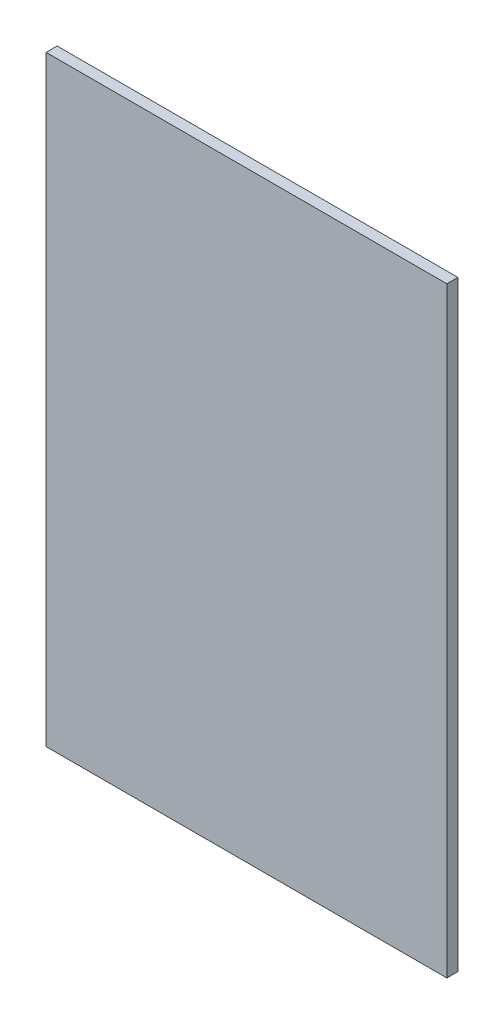
ISO-10303-21;
HEADER;
FILE_DESCRIPTION(('STEP AP214'),'2;1');
FILE_NAME('part.step','',(''),(''),'','','');
FILE_SCHEMA(('AUTOMOTIVE_DESIGN { 1 0 10303 214 1 1 1 1 }'));
ENDSEC;
DATA;
#1=APPLICATION_CONTEXT('core data for automotive mechanical design processes');
#2=APPLICATION_PROTOCOL_DEFINITION('international standard','automotive_design',2000,#1);
#3=PRODUCT_CONTEXT('',#1,'mechanical');
#4=PRODUCT('Part','Part','',(#3));
#5=PRODUCT_RELATED_PRODUCT_CATEGORY('part','',(#4));
#6=PRODUCT_DEFINITION_FORMATION('','',#4);
#7=PRODUCT_DEFINITION_CONTEXT('part definition',#1,'design');
#8=PRODUCT_DEFINITION('design','',#6,#7);
#9=PRODUCT_DEFINITION_SHAPE('','',#8);
#10=(LENGTH_UNIT() NAMED_UNIT(*) SI_UNIT(.MILLI.,.METRE.));
#11=(NAMED_UNIT(*) PLANE_ANGLE_UNIT() SI_UNIT($,.RADIAN.));
#12=(NAMED_UNIT(*) SI_UNIT($,.STERADIAN.) SOLID_ANGLE_UNIT());
#13=UNCERTAINTY_MEASURE_WITH_UNIT(LENGTH_MEASURE(1.E-05),#10,'distance_accuracy_value','');
#14=(GEOMETRIC_REPRESENTATION_CONTEXT(3) GLOBAL_UNCERTAINTY_ASSIGNED_CONTEXT((#13)) GLOBAL_UNIT_ASSIGNED_CONTEXT((#10,
#11,#12)) REPRESENTATION_CONTEXT('',''));
#15=CARTESIAN_POINT('',(0.,0.,0.));
#16=DIRECTION('',(0.,0.,1.));
#17=DIRECTION('',(1.,0.,0.));
#18=AXIS2_PLACEMENT_3D('',#15,#16,#17);
#19=CARTESIAN_POINT('',(114.832,-135.254,1.635));
#20=DIRECTION('',(0.,0.,-1.));
#21=DIRECTION('',(0.,-1.,0.));
#22=AXIS2_PLACEMENT_3D('',#19,#20,#21);
#23=PLANE('',#22);
#24=DIRECTION('',(0.,-1.,0.));
#25=VECTOR('',#24,1.);
#26=CARTESIAN_POINT('',(115.467,-134.3015,1.635));
#27=LINE('',#26,#25);
#28=CARTESIAN_POINT('',(115.467,-134.3015,1.635));
#29=VERTEX_POINT('',#28);
#30=CARTESIAN_POINT('',(115.467,-136.2065,1.635));
#31=VERTEX_POINT('',#30);
#32=EDGE_CURVE('E20',#29,#31,#27,.T.);
#33=ORIENTED_EDGE('',*,*,#32,.F.);
#34=DIRECTION('',(1.,0.,0.));
#35=VECTOR('',#34,1.);
#36=CARTESIAN_POINT('',(114.197,-134.3015,1.635));
#37=LINE('',#36,#35);
#38=CARTESIAN_POINT('',(114.197,-134.3015,1.635));
#39=VERTEX_POINT('',#38);
#40=EDGE_CURVE('E102',#39,#29,#37,.T.);
#41=ORIENTED_EDGE('',*,*,#40,.F.);
#42=DIRECTION('',(0.,1.,0.));
#43=VECTOR('',#42,1.);
#44=CARTESIAN_POINT('',(114.197,-136.2065,1.635));
#45=LINE('',#44,#43);
#46=CARTESIAN_POINT('',(114.197,-136.2065,1.635));
#47=VERTEX_POINT('',#46);
#48=EDGE_CURVE('E83',#47,#39,#45,.T.);
#49=ORIENTED_EDGE('',*,*,#48,.F.);
#50=DIRECTION('',(-1.,0.,0.));
#51=VECTOR('',#50,1.);
#52=CARTESIAN_POINT('',(115.467,-136.2065,1.635));
#53=LINE('',#52,#51);
#54=EDGE_CURVE('E87',#31,#47,#53,.T.);
#55=ORIENTED_EDGE('',*,*,#54,.F.);
#56=EDGE_LOOP('',(#33,#41,#49,#55));
#57=FACE_BOUND('',#56,.T.);
#58=ADVANCED_FACE('F17',(#57),#23,.F.);
#59=CARTESIAN_POINT('',(114.832,-135.254,1.6));
#60=DIRECTION('',(0.,0.,-1.));
#61=DIRECTION('',(0.,-1.,0.));
#62=AXIS2_PLACEMENT_3D('',#59,#60,#61);
#63=PLANE('',#62);
#64=DIRECTION('',(-1.,0.,0.));
#65=VECTOR('',#64,1.);
#66=CARTESIAN_POINT('',(115.467,-136.2065,1.6));
#67=LINE('',#66,#65);
#68=CARTESIAN_POINT('',(115.467,-136.2065,1.6));
#69=VERTEX_POINT('',#68);
#70=CARTESIAN_POINT('',(114.197,-136.2065,1.6));
#71=VERTEX_POINT('',#70);
#72=EDGE_CURVE('E71',#69,#71,#67,.T.);
#73=ORIENTED_EDGE('',*,*,#72,.T.);
#74=DIRECTION('',(0.,1.,0.));
#75=VECTOR('',#74,1.);
#76=CARTESIAN_POINT('',(114.197,-136.2065,1.6));
#77=LINE('',#76,#75);
#78=CARTESIAN_POINT('',(114.197,-134.3015,1.6));
#79=VERTEX_POINT('',#78);
#80=EDGE_CURVE('E99',#71,#79,#77,.T.);
#81=ORIENTED_EDGE('',*,*,#80,.T.);
#82=DIRECTION('',(1.,0.,0.));
#83=VECTOR('',#82,1.);
#84=CARTESIAN_POINT('',(114.197,-134.3015,1.6));
#85=LINE('',#84,#83);
#86=CARTESIAN_POINT('',(115.467,-134.3015,1.6));
#87=VERTEX_POINT('',#86);
#88=EDGE_CURVE('E73',#79,#87,#85,.T.);
#89=ORIENTED_EDGE('',*,*,#88,.T.);
#90=DIRECTION('',(0.,-1.,0.));
#91=VECTOR('',#90,1.);
#92=CARTESIAN_POINT('',(115.467,-134.3015,1.6));
#93=LINE('',#92,#91);
#94=EDGE_CURVE('E11',#87,#69,#93,.T.);
#95=ORIENTED_EDGE('',*,*,#94,.T.);
#96=EDGE_LOOP('',(#73,#81,#89,#95));
#97=FACE_BOUND('',#96,.T.);
#98=ADVANCED_FACE('F69',(#97),#63,.T.);
#99=CARTESIAN_POINT('',(115.467,-134.3015,1.6));
#100=DIRECTION('',(1.,0.,0.));
#101=DIRECTION('',(0.,1.,0.));
#102=AXIS2_PLACEMENT_3D('',#99,#100,#101);
#103=PLANE('',#102);
#104=DIRECTION('',(0.,0.,1.));
#105=VECTOR('',#104,1.);
#106=CARTESIAN_POINT('',(115.467,-134.3015,1.6));
#107=LINE('',#106,#105);
#108=EDGE_CURVE('E109',#87,#29,#107,.T.);
#109=ORIENTED_EDGE('',*,*,#108,.T.);
#110=ORIENTED_EDGE('',*,*,#32,.T.);
#111=DIRECTION('',(0.,0.,1.));
#112=VECTOR('',#111,1.);
#113=CARTESIAN_POINT('',(115.467,-136.2065,1.6));
#114=LINE('',#113,#112);
#115=EDGE_CURVE('E79',#69,#31,#114,.T.);
#116=ORIENTED_EDGE('',*,*,#115,.F.);
#117=ORIENTED_EDGE('',*,*,#94,.F.);
#118=EDGE_LOOP('',(#109,#110,#116,#117));
#119=FACE_BOUND('',#118,.T.);
#120=ADVANCED_FACE('F85',(#119),#103,.T.);
#121=CARTESIAN_POINT('',(114.197,-134.3015,1.6));
#122=DIRECTION('',(0.,1.,0.));
#123=DIRECTION('',(1.,0.,0.));
#124=AXIS2_PLACEMENT_3D('',#121,#122,#123);
#125=PLANE('',#124);
#126=DIRECTION('',(0.,0.,1.));
#127=VECTOR('',#126,1.);
#128=CARTESIAN_POINT('',(114.197,-134.3015,1.6));
#129=LINE('',#128,#127);
#130=EDGE_CURVE('E95',#79,#39,#129,.T.);
#131=ORIENTED_EDGE('',*,*,#130,.T.);
#132=ORIENTED_EDGE('',*,*,#40,.T.);
#133=ORIENTED_EDGE('',*,*,#108,.F.);
#134=ORIENTED_EDGE('',*,*,#88,.F.);
#135=EDGE_LOOP('',(#131,#132,#133,#134));
#136=FACE_BOUND('',#135,.T.);
#137=ADVANCED_FACE('F140',(#136),#125,.T.);
#138=CARTESIAN_POINT('',(114.197,-136.2065,1.6));
#139=DIRECTION('',(-1.,0.,0.));
#140=DIRECTION('',(0.,0.,1.));
#141=AXIS2_PLACEMENT_3D('',#138,#139,#140);
#142=PLANE('',#141);
#143=DIRECTION('',(0.,0.,1.));
#144=VECTOR('',#143,1.);
#145=CARTESIAN_POINT('',(114.197,-136.2065,1.6));
#146=LINE('',#145,#144);
#147=EDGE_CURVE('E81',#71,#47,#146,.T.);
#148=ORIENTED_EDGE('',*,*,#147,.T.);
#149=ORIENTED_EDGE('',*,*,#48,.T.);
#150=ORIENTED_EDGE('',*,*,#130,.F.);
#151=ORIENTED_EDGE('',*,*,#80,.F.);
#152=EDGE_LOOP('',(#148,#149,#150,#151));
#153=FACE_BOUND('',#152,.T.);
#154=ADVANCED_FACE('F130',(#153),#142,.T.);
#155=CARTESIAN_POINT('',(115.467,-136.2065,1.6));
#156=DIRECTION('',(0.,-1.,0.));
#157=DIRECTION('',(0.,0.,-1.));
#158=AXIS2_PLACEMENT_3D('',#155,#156,#157);
#159=PLANE('',#158);
#160=ORIENTED_EDGE('',*,*,#115,.T.);
#161=ORIENTED_EDGE('',*,*,#54,.T.);
#162=ORIENTED_EDGE('',*,*,#147,.F.);
#163=ORIENTED_EDGE('',*,*,#72,.F.);
#164=EDGE_LOOP('',(#160,#161,#162,#163));
#165=FACE_BOUND('',#164,.T.);
#166=ADVANCED_FACE('F77',(#165),#159,.T.);
#167=CLOSED_SHELL('',(#58,#98,#120,#137,#154,#166));
#168=MANIFOLD_SOLID_BREP('B1',#167);
#169=ADVANCED_BREP_SHAPE_REPRESENTATION('',(#18,#168),#14);
#170=SHAPE_DEFINITION_REPRESENTATION(#9,#169);
ENDSEC;
END-ISO-10303-21;
